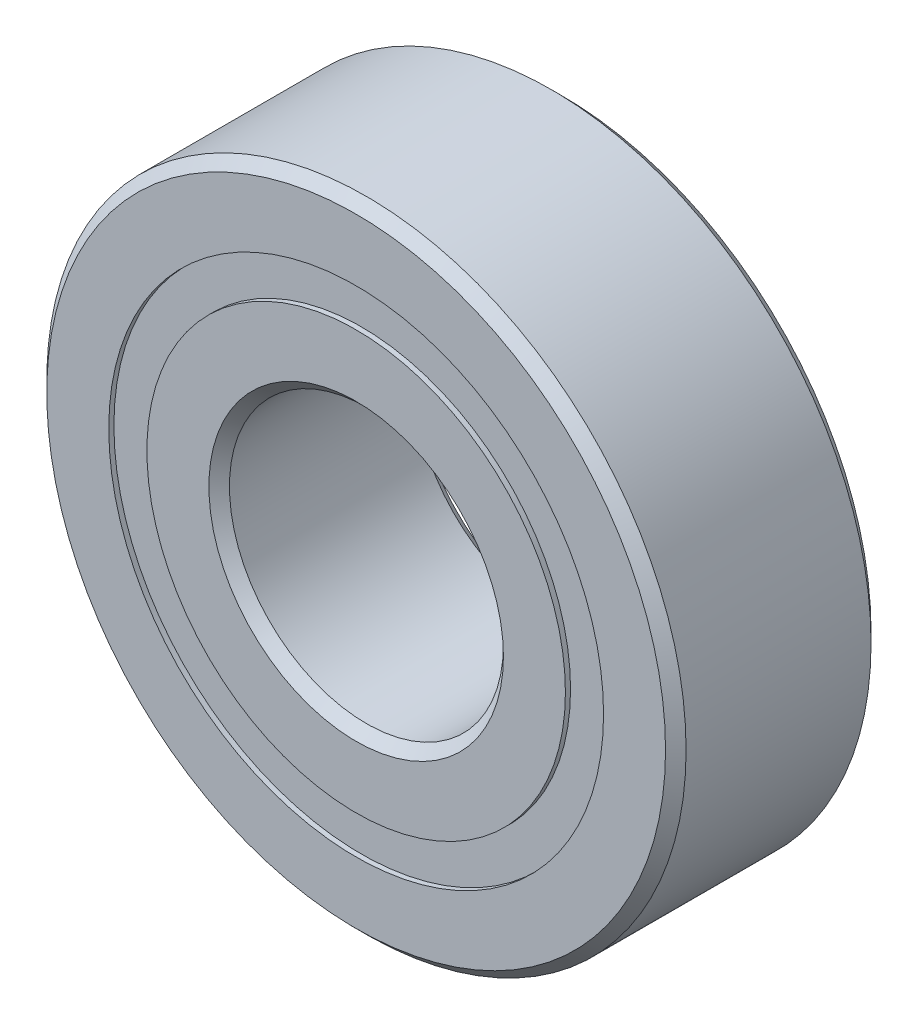
ISO-10303-21;
HEADER;
FILE_DESCRIPTION(('STEP AP214'),'2;1');
FILE_NAME('part.step','',(''),(''),'','','');
FILE_SCHEMA(('AUTOMOTIVE_DESIGN { 1 0 10303 214 1 1 1 1 }'));
ENDSEC;
DATA;
#1=APPLICATION_CONTEXT('core data for automotive mechanical design processes');
#2=APPLICATION_PROTOCOL_DEFINITION('international standard','automotive_design',2000,#1);
#3=PRODUCT_CONTEXT('',#1,'mechanical');
#4=PRODUCT('Part','Part','',(#3));
#5=PRODUCT_RELATED_PRODUCT_CATEGORY('part','',(#4));
#6=PRODUCT_DEFINITION_FORMATION('','',#4);
#7=PRODUCT_DEFINITION_CONTEXT('part definition',#1,'design');
#8=PRODUCT_DEFINITION('design','',#6,#7);
#9=PRODUCT_DEFINITION_SHAPE('','',#8);
#10=(LENGTH_UNIT() NAMED_UNIT(*) SI_UNIT(.MILLI.,.METRE.));
#11=(NAMED_UNIT(*) PLANE_ANGLE_UNIT() SI_UNIT($,.RADIAN.));
#12=(NAMED_UNIT(*) SI_UNIT($,.STERADIAN.) SOLID_ANGLE_UNIT());
#13=UNCERTAINTY_MEASURE_WITH_UNIT(LENGTH_MEASURE(1.E-05),#10,'distance_accuracy_value','');
#14=(GEOMETRIC_REPRESENTATION_CONTEXT(3) GLOBAL_UNCERTAINTY_ASSIGNED_CONTEXT((#13)) GLOBAL_UNIT_ASSIGNED_CONTEXT((#10,
#11,#12)) REPRESENTATION_CONTEXT('',''));
#15=CARTESIAN_POINT('',(0.,0.,0.));
#16=DIRECTION('',(0.,0.,1.));
#17=DIRECTION('',(1.,0.,0.));
#18=AXIS2_PLACEMENT_3D('',#15,#16,#17);
#19=CARTESIAN_POINT('',(0.,8.60041208791209,-3.39328125));
#20=DIRECTION('',(0.,0.,1.));
#21=DIRECTION('',(1.,0.,0.));
#22=AXIS2_PLACEMENT_3D('',#19,#20,#21);
#23=PLANE('',#22);
#24=CARTESIAN_POINT('',(0.,0.,-3.39328125));
#25=DIRECTION('',(0.,0.,1.));
#26=DIRECTION('',(1.,0.,0.));
#27=AXIS2_PLACEMENT_3D('',#24,#25,#26);
#28=CIRCLE('',#27,8.60041208791209);
#29=CARTESIAN_POINT('',(8.60041208791209,0.,-3.39328125));
#30=VERTEX_POINT('',#29);
#31=EDGE_CURVE('E58',#30,#30,#28,.T.);
#32=ORIENTED_EDGE('',*,*,#31,.F.);
#33=EDGE_LOOP('',(#32));
#34=FACE_BOUND('',#33,.T.);
#35=CARTESIAN_POINT('',(0.,0.,-3.39328125));
#36=DIRECTION('',(0.,0.,1.));
#37=DIRECTION('',(1.,0.,0.));
#38=AXIS2_PLACEMENT_3D('',#35,#36,#37);
#39=CIRCLE('',#38,7.27458791208791);
#40=CARTESIAN_POINT('',(7.27458791208791,0.,-3.39328125));
#41=VERTEX_POINT('',#40);
#42=EDGE_CURVE('E11',#41,#41,#39,.T.);
#43=ORIENTED_EDGE('',*,*,#42,.T.);
#44=EDGE_LOOP('',(#43));
#45=FACE_BOUND('',#44,.T.);
#46=ADVANCED_FACE('F44',(#34,#45),#23,.F.);
#47=CARTESIAN_POINT('',(0.,0.,3.571875));
#48=DIRECTION('',(0.,0.,1.));
#49=DIRECTION('',(1.,0.,0.));
#50=AXIS2_PLACEMENT_3D('',#47,#48,#49);
#51=CYLINDRICAL_SURFACE('',#50,7.27458791208791);
#52=ORIENTED_EDGE('',*,*,#42,.F.);
#53=EDGE_LOOP('',(#52));
#54=FACE_BOUND('',#53,.T.);
#55=CARTESIAN_POINT('',(0.,0.,-1.72035132641561));
#56=DIRECTION('',(0.,0.,1.));
#57=DIRECTION('',(1.,0.,0.));
#58=AXIS2_PLACEMENT_3D('',#55,#56,#57);
#59=CIRCLE('',#58,7.27458791208791);
#60=CARTESIAN_POINT('',(7.27458791208791,0.,-1.72035132641561));
#61=VERTEX_POINT('',#60);
#62=EDGE_CURVE('E50',#61,#61,#59,.T.);
#63=ORIENTED_EDGE('',*,*,#62,.T.);
#64=EDGE_LOOP('',(#63));
#65=FACE_BOUND('',#64,.T.);
#66=ADVANCED_FACE('F67',(#54,#65),#51,.F.);
#67=CARTESIAN_POINT('',(0.,8.60041208791209,-1.72035132641561));
#68=DIRECTION('',(0.,0.,-1.));
#69=DIRECTION('',(-1.,0.,0.));
#70=AXIS2_PLACEMENT_3D('',#67,#68,#69);
#71=PLANE('',#70);
#72=ORIENTED_EDGE('',*,*,#62,.F.);
#73=EDGE_LOOP('',(#72));
#74=FACE_BOUND('',#73,.T.);
#75=CARTESIAN_POINT('',(0.,0.,-1.72035132641561));
#76=DIRECTION('',(0.,0.,1.));
#77=DIRECTION('',(1.,0.,0.));
#78=AXIS2_PLACEMENT_3D('',#75,#76,#77);
#79=CIRCLE('',#78,8.60041208791209);
#80=CARTESIAN_POINT('',(8.60041208791209,0.,-1.72035132641561));
#81=VERTEX_POINT('',#80);
#82=EDGE_CURVE('E54',#81,#81,#79,.T.);
#83=ORIENTED_EDGE('',*,*,#82,.T.);
#84=EDGE_LOOP('',(#83));
#85=FACE_BOUND('',#84,.T.);
#86=ADVANCED_FACE('F71',(#74,#85),#71,.F.);
#87=CARTESIAN_POINT('',(0.,0.,3.571875));
#88=DIRECTION('',(0.,0.,1.));
#89=DIRECTION('',(1.,0.,0.));
#90=AXIS2_PLACEMENT_3D('',#87,#88,#89);
#91=CYLINDRICAL_SURFACE('',#90,8.60041208791209);
#92=ORIENTED_EDGE('',*,*,#82,.F.);
#93=EDGE_LOOP('',(#92));
#94=FACE_BOUND('',#93,.T.);
#95=ORIENTED_EDGE('',*,*,#31,.T.);
#96=EDGE_LOOP('',(#95));
#97=FACE_BOUND('',#96,.T.);
#98=ADVANCED_FACE('F64',(#94,#97),#91,.T.);
#99=CLOSED_SHELL('',(#46,#66,#86,#98));
#100=MANIFOLD_SOLID_BREP('B2',#99);
#101=CARTESIAN_POINT('',(0.,8.60041208791209,3.39328125));
#102=DIRECTION('',(0.,0.,-1.));
#103=DIRECTION('',(-1.,0.,0.));
#104=AXIS2_PLACEMENT_3D('',#101,#102,#103);
#105=PLANE('',#104);
#106=CARTESIAN_POINT('',(0.,0.,3.39328125));
#107=DIRECTION('',(0.,0.,1.));
#108=DIRECTION('',(1.,0.,0.));
#109=AXIS2_PLACEMENT_3D('',#106,#107,#108);
#110=CIRCLE('',#109,7.27458791208791);
#111=CARTESIAN_POINT('',(7.27458791208791,0.,3.39328125));
#112=VERTEX_POINT('',#111);
#113=EDGE_CURVE('E43',#112,#112,#110,.T.);
#114=ORIENTED_EDGE('',*,*,#113,.F.);
#115=EDGE_LOOP('',(#114));
#116=FACE_BOUND('',#115,.T.);
#117=CARTESIAN_POINT('',(0.,0.,3.39328125));
#118=DIRECTION('',(0.,0.,1.));
#119=DIRECTION('',(1.,0.,0.));
#120=AXIS2_PLACEMENT_3D('',#117,#118,#119);
#121=CIRCLE('',#120,8.60041208791209);
#122=CARTESIAN_POINT('',(8.60041208791209,0.,3.39328125));
#123=VERTEX_POINT('',#122);
#124=EDGE_CURVE('E126',#123,#123,#121,.T.);
#125=ORIENTED_EDGE('',*,*,#124,.T.);
#126=EDGE_LOOP('',(#125));
#127=FACE_BOUND('',#126,.T.);
#128=ADVANCED_FACE('F112',(#116,#127),#105,.F.);
#129=CARTESIAN_POINT('',(0.,0.,3.571875));
#130=DIRECTION('',(0.,0.,1.));
#131=DIRECTION('',(1.,0.,0.));
#132=AXIS2_PLACEMENT_3D('',#129,#130,#131);
#133=CYLINDRICAL_SURFACE('',#132,7.27458791208791);
#134=CARTESIAN_POINT('',(0.,0.,1.72035132641561));
#135=DIRECTION('',(0.,0.,1.));
#136=DIRECTION('',(1.,0.,0.));
#137=AXIS2_PLACEMENT_3D('',#134,#135,#136);
#138=CIRCLE('',#137,7.27458791208791);
#139=CARTESIAN_POINT('',(7.27458791208791,0.,1.72035132641561));
#140=VERTEX_POINT('',#139);
#141=EDGE_CURVE('E118',#140,#140,#138,.T.);
#142=ORIENTED_EDGE('',*,*,#141,.F.);
#143=EDGE_LOOP('',(#142));
#144=FACE_BOUND('',#143,.T.);
#145=ORIENTED_EDGE('',*,*,#113,.T.);
#146=EDGE_LOOP('',(#145));
#147=FACE_BOUND('',#146,.T.);
#148=ADVANCED_FACE('F141',(#144,#147),#133,.F.);
#149=CARTESIAN_POINT('',(0.,8.60041208791209,1.72035132641561));
#150=DIRECTION('',(0.,0.,1.));
#151=DIRECTION('',(1.,0.,0.));
#152=AXIS2_PLACEMENT_3D('',#149,#150,#151);
#153=PLANE('',#152);
#154=CARTESIAN_POINT('',(0.,0.,1.72035132641561));
#155=DIRECTION('',(0.,0.,1.));
#156=DIRECTION('',(1.,0.,0.));
#157=AXIS2_PLACEMENT_3D('',#154,#155,#156);
#158=CIRCLE('',#157,8.60041208791209);
#159=CARTESIAN_POINT('',(8.60041208791209,0.,1.72035132641561));
#160=VERTEX_POINT('',#159);
#161=EDGE_CURVE('E122',#160,#160,#158,.T.);
#162=ORIENTED_EDGE('',*,*,#161,.F.);
#163=EDGE_LOOP('',(#162));
#164=FACE_BOUND('',#163,.T.);
#165=ORIENTED_EDGE('',*,*,#141,.T.);
#166=EDGE_LOOP('',(#165));
#167=FACE_BOUND('',#166,.T.);
#168=ADVANCED_FACE('F136',(#164,#167),#153,.F.);
#169=CARTESIAN_POINT('',(0.,0.,3.571875));
#170=DIRECTION('',(0.,0.,1.));
#171=DIRECTION('',(1.,0.,0.));
#172=AXIS2_PLACEMENT_3D('',#169,#170,#171);
#173=CYLINDRICAL_SURFACE('',#172,8.60041208791209);
#174=ORIENTED_EDGE('',*,*,#124,.F.);
#175=EDGE_LOOP('',(#174));
#176=FACE_BOUND('',#175,.T.);
#177=ORIENTED_EDGE('',*,*,#161,.T.);
#178=EDGE_LOOP('',(#177));
#179=FACE_BOUND('',#178,.T.);
#180=ADVANCED_FACE('F133',(#176,#179),#173,.T.);
#181=CLOSED_SHELL('',(#128,#148,#168,#180));
#182=MANIFOLD_SOLID_BREP('B6',#181);
#183=CARTESIAN_POINT('',(-4.66554544007142,6.42157239285121,0.));
#184=DIRECTION('',(0.,0.,1.));
#185=DIRECTION('',(-0.587785252292462,0.809016994374955,0.));
#186=AXIS2_PLACEMENT_3D('',#183,#184,#185);
#187=SPHERICAL_SURFACE('',#186,1.72035132641561);
#188=CARTESIAN_POINT('',(-4.66554544007142,6.42157239285121,1.72035132641561));
#189=VERTEX_POINT('',#188);
#190=VERTEX_LOOP('',#189);
#191=FACE_BOUND('',#190,.T.);
#192=ADVANCED_FACE('F179',(#191),#187,.T.);
#193=CLOSED_SHELL('',(#192));
#194=MANIFOLD_SOLID_BREP('B38',#193);
#195=CARTESIAN_POINT('',(-7.54901109809275,2.45282239285123,0.));
#196=DIRECTION('',(0.,0.,1.));
#197=DIRECTION('',(-0.95105651629515,0.309016994374958,0.));
#198=AXIS2_PLACEMENT_3D('',#195,#196,#197);
#199=SPHERICAL_SURFACE('',#198,1.72035132641561);
#200=CARTESIAN_POINT('',(-7.54901109809275,2.45282239285123,1.72035132641561));
#201=VERTEX_POINT('',#200);
#202=VERTEX_LOOP('',#201);
#203=FACE_BOUND('',#202,.T.);
#204=ADVANCED_FACE('F199',(#203),#199,.T.);
#205=CLOSED_SHELL('',(#204));
#206=MANIFOLD_SOLID_BREP('B108',#205);
#207=CARTESIAN_POINT('',(-7.54901109809281,-2.45282239285107,0.));
#208=DIRECTION('',(0.,0.,1.));
#209=DIRECTION('',(-0.951056516295157,-0.309016994374938,0.));
#210=AXIS2_PLACEMENT_3D('',#207,#208,#209);
#211=SPHERICAL_SURFACE('',#210,1.72035132641561);
#212=CARTESIAN_POINT('',(-7.54901109809281,-2.45282239285107,1.72035132641561));
#213=VERTEX_POINT('',#212);
#214=VERTEX_LOOP('',#213);
#215=FACE_BOUND('',#214,.T.);
#216=ADVANCED_FACE('F219',(#215),#211,.T.);
#217=CLOSED_SHELL('',(#216));
#218=MANIFOLD_SOLID_BREP('B175',#217);
#219=CARTESIAN_POINT('',(-4.66554544007156,-6.42157239285111,0.));
#220=DIRECTION('',(0.,0.,1.));
#221=DIRECTION('',(-0.58778525229248,-0.809016994374942,0.));
#222=AXIS2_PLACEMENT_3D('',#219,#220,#221);
#223=SPHERICAL_SURFACE('',#222,1.72035132641561);
#224=CARTESIAN_POINT('',(-4.66554544007156,-6.42157239285111,1.72035132641561));
#225=VERTEX_POINT('',#224);
#226=VERTEX_LOOP('',#225);
#227=FACE_BOUND('',#226,.T.);
#228=ADVANCED_FACE('F239',(#227),#223,.T.);
#229=CLOSED_SHELL('',(#228));
#230=MANIFOLD_SOLID_BREP('B195',#229);
#231=CARTESIAN_POINT('',(0.,-7.9375,0.));
#232=DIRECTION('',(0.,0.,1.));
#233=DIRECTION('',(0.,-1.,0.));
#234=AXIS2_PLACEMENT_3D('',#231,#232,#233);
#235=SPHERICAL_SURFACE('',#234,1.72035132641561);
#236=CARTESIAN_POINT('',(0.,-7.9375,1.72035132641561));
#237=VERTEX_POINT('',#236);
#238=VERTEX_LOOP('',#237);
#239=FACE_BOUND('',#238,.T.);
#240=ADVANCED_FACE('F259',(#239),#235,.T.);
#241=CLOSED_SHELL('',(#240));
#242=MANIFOLD_SOLID_BREP('B215',#241);
#243=CARTESIAN_POINT('',(4.66554544007147,-6.42157239285117,0.));
#244=DIRECTION('',(0.,0.,1.));
#245=DIRECTION('',(0.587785252292469,-0.809016994374951,0.));
#246=AXIS2_PLACEMENT_3D('',#243,#244,#245);
#247=SPHERICAL_SURFACE('',#246,1.72035132641561);
#248=CARTESIAN_POINT('',(4.66554544007147,-6.42157239285117,1.72035132641561));
#249=VERTEX_POINT('',#248);
#250=VERTEX_LOOP('',#249);
#251=FACE_BOUND('',#250,.T.);
#252=ADVANCED_FACE('F279',(#251),#247,.T.);
#253=CLOSED_SHELL('',(#252));
#254=MANIFOLD_SOLID_BREP('B235',#253);
#255=CARTESIAN_POINT('',(7.54901109809277,-2.45282239285118,0.));
#256=DIRECTION('',(0.,0.,1.));
#257=DIRECTION('',(0.951056516295152,-0.309016994374952,0.));
#258=AXIS2_PLACEMENT_3D('',#255,#256,#257);
#259=SPHERICAL_SURFACE('',#258,1.72035132641561);
#260=CARTESIAN_POINT('',(7.54901109809277,-2.45282239285118,1.72035132641561));
#261=VERTEX_POINT('',#260);
#262=VERTEX_LOOP('',#261);
#263=FACE_BOUND('',#262,.T.);
#264=ADVANCED_FACE('F299',(#263),#259,.T.);
#265=CLOSED_SHELL('',(#264));
#266=MANIFOLD_SOLID_BREP('B255',#265);
#267=CARTESIAN_POINT('',(7.54901109809279,2.45282239285112,0.));
#268=DIRECTION('',(0.,0.,1.));
#269=DIRECTION('',(0.951056516295155,0.309016994374945,0.));
#270=AXIS2_PLACEMENT_3D('',#267,#268,#269);
#271=SPHERICAL_SURFACE('',#270,1.72035132641561);
#272=CARTESIAN_POINT('',(7.54901109809279,2.45282239285112,1.72035132641561));
#273=VERTEX_POINT('',#272);
#274=VERTEX_LOOP('',#273);
#275=FACE_BOUND('',#274,.T.);
#276=ADVANCED_FACE('F319',(#275),#271,.T.);
#277=CLOSED_SHELL('',(#276));
#278=MANIFOLD_SOLID_BREP('B275',#277);
#279=CARTESIAN_POINT('',(4.66554544007152,6.42157239285114,0.));
#280=DIRECTION('',(0.,0.,1.));
#281=DIRECTION('',(0.587785252292474,0.809016994374947,0.));
#282=AXIS2_PLACEMENT_3D('',#279,#280,#281);
#283=SPHERICAL_SURFACE('',#282,1.72035132641561);
#284=CARTESIAN_POINT('',(4.66554544007152,6.42157239285114,1.72035132641561));
#285=VERTEX_POINT('',#284);
#286=VERTEX_LOOP('',#285);
#287=FACE_BOUND('',#286,.T.);
#288=ADVANCED_FACE('F339',(#287),#283,.T.);
#289=CLOSED_SHELL('',(#288));
#290=MANIFOLD_SOLID_BREP('B295',#289);
#291=CARTESIAN_POINT('',(0.,7.9375,0.));
#292=DIRECTION('',(0.,0.,1.));
#293=DIRECTION('',(0.,1.,0.));
#294=AXIS2_PLACEMENT_3D('',#291,#292,#293);
#295=SPHERICAL_SURFACE('',#294,1.72035132641561);
#296=CARTESIAN_POINT('',(0.,7.9375,1.72035132641561));
#297=VERTEX_POINT('',#296);
#298=VERTEX_LOOP('',#297);
#299=FACE_BOUND('',#298,.T.);
#300=ADVANCED_FACE('F362',(#299),#295,.T.);
#301=CLOSED_SHELL('',(#300));
#302=MANIFOLD_SOLID_BREP('B315',#301);
#303=CARTESIAN_POINT('',(0.,7.27458791208791,3.571875));
#304=DIRECTION('',(0.,0.,-1.));
#305=DIRECTION('',(-1.,0.,0.));
#306=AXIS2_PLACEMENT_3D('',#303,#304,#305);
#307=PLANE('',#306);
#308=CARTESIAN_POINT('',(0.,0.,3.571875));
#309=DIRECTION('',(0.,0.,1.));
#310=DIRECTION('',(1.,0.,0.));
#311=AXIS2_PLACEMENT_3D('',#308,#309,#310);
#312=CIRCLE('',#311,5.1196875);
#313=CARTESIAN_POINT('',(5.1196875,0.,3.571875));
#314=VERTEX_POINT('',#313);
#315=EDGE_CURVE('E410',#314,#314,#312,.T.);
#316=ORIENTED_EDGE('',*,*,#315,.F.);
#317=EDGE_LOOP('',(#316));
#318=FACE_BOUND('',#317,.T.);
#319=CARTESIAN_POINT('',(0.,0.,3.571875));
#320=DIRECTION('',(0.,0.,1.));
#321=DIRECTION('',(1.,0.,0.));
#322=AXIS2_PLACEMENT_3D('',#319,#320,#321);
#323=CIRCLE('',#322,7.27458791208791);
#324=CARTESIAN_POINT('',(7.27458791208791,0.,3.571875));
#325=VERTEX_POINT('',#324);
#326=EDGE_CURVE('E361',#325,#325,#323,.T.);
#327=ORIENTED_EDGE('',*,*,#326,.T.);
#328=EDGE_LOOP('',(#327));
#329=FACE_BOUND('',#328,.T.);
#330=ADVANCED_FACE('F382',(#318,#329),#307,.F.);
#331=CARTESIAN_POINT('',(0.,0.,3.571875));
#332=DIRECTION('',(0.,0.,1.));
#333=DIRECTION('',(1.,0.,0.));
#334=AXIS2_PLACEMENT_3D('',#331,#332,#333);
#335=CYLINDRICAL_SURFACE('',#334,7.27458791208791);
#336=ORIENTED_EDGE('',*,*,#326,.F.);
#337=EDGE_LOOP('',(#336));
#338=FACE_BOUND('',#337,.T.);
#339=CARTESIAN_POINT('',(0.,0.,1.5875));
#340=DIRECTION('',(0.,0.,1.));
#341=DIRECTION('',(1.,0.,0.));
#342=AXIS2_PLACEMENT_3D('',#339,#340,#341);
#343=CIRCLE('',#342,7.27458791208791);
#344=CARTESIAN_POINT('',(7.27458791208791,0.,1.5875));
#345=VERTEX_POINT('',#344);
#346=EDGE_CURVE('E388',#345,#345,#343,.T.);
#347=ORIENTED_EDGE('',*,*,#346,.T.);
#348=EDGE_LOOP('',(#347));
#349=FACE_BOUND('',#348,.T.);
#350=ADVANCED_FACE('F417',(#338,#349),#335,.T.);
#351=CARTESIAN_POINT('',(0.,0.,0.));
#352=DIRECTION('',(0.,0.,1.));
#353=DIRECTION('',(1.,0.,0.));
#354=AXIS2_PLACEMENT_3D('',#351,#352,#353);
#355=TOROIDAL_SURFACE('',#354,7.93749999999999,1.72035132641561);
#356=ORIENTED_EDGE('',*,*,#346,.F.);
#357=EDGE_LOOP('',(#356));
#358=FACE_BOUND('',#357,.T.);
#359=CARTESIAN_POINT('',(0.,0.,-1.5875));
#360=DIRECTION('',(0.,0.,1.));
#361=DIRECTION('',(1.,0.,0.));
#362=AXIS2_PLACEMENT_3D('',#359,#360,#361);
#363=CIRCLE('',#362,7.27458791208791);
#364=CARTESIAN_POINT('',(7.27458791208791,0.,-1.5875));
#365=VERTEX_POINT('',#364);
#366=EDGE_CURVE('E392',#365,#365,#363,.T.);
#367=ORIENTED_EDGE('',*,*,#366,.T.);
#368=EDGE_LOOP('',(#367));
#369=FACE_BOUND('',#368,.T.);
#370=ADVANCED_FACE('F421',(#358,#369),#355,.F.);
#371=CARTESIAN_POINT('',(0.,0.,3.571875));
#372=DIRECTION('',(0.,0.,1.));
#373=DIRECTION('',(1.,0.,0.));
#374=AXIS2_PLACEMENT_3D('',#371,#372,#373);
#375=CYLINDRICAL_SURFACE('',#374,7.27458791208791);
#376=ORIENTED_EDGE('',*,*,#366,.F.);
#377=EDGE_LOOP('',(#376));
#378=FACE_BOUND('',#377,.T.);
#379=CARTESIAN_POINT('',(0.,0.,-3.571875));
#380=DIRECTION('',(0.,0.,1.));
#381=DIRECTION('',(1.,0.,0.));
#382=AXIS2_PLACEMENT_3D('',#379,#380,#381);
#383=CIRCLE('',#382,7.27458791208791);
#384=CARTESIAN_POINT('',(7.27458791208791,0.,-3.571875));
#385=VERTEX_POINT('',#384);
#386=EDGE_CURVE('E396',#385,#385,#383,.T.);
#387=ORIENTED_EDGE('',*,*,#386,.T.);
#388=EDGE_LOOP('',(#387));
#389=FACE_BOUND('',#388,.T.);
#390=ADVANCED_FACE('F426',(#378,#389),#375,.T.);
#391=CARTESIAN_POINT('',(0.,5.1196875,-3.571875));
#392=DIRECTION('',(0.,0.,1.));
#393=DIRECTION('',(1.,0.,0.));
#394=AXIS2_PLACEMENT_3D('',#391,#392,#393);
#395=PLANE('',#394);
#396=ORIENTED_EDGE('',*,*,#386,.F.);
#397=EDGE_LOOP('',(#396));
#398=FACE_BOUND('',#397,.T.);
#399=CARTESIAN_POINT('',(0.,0.,-3.571875));
#400=DIRECTION('',(0.,0.,1.));
#401=DIRECTION('',(1.,0.,0.));
#402=AXIS2_PLACEMENT_3D('',#399,#400,#401);
#403=CIRCLE('',#402,5.1196875);
#404=CARTESIAN_POINT('',(5.1196875,0.,-3.571875));
#405=VERTEX_POINT('',#404);
#406=EDGE_CURVE('E401',#405,#405,#403,.T.);
#407=ORIENTED_EDGE('',*,*,#406,.T.);
#408=EDGE_LOOP('',(#407));
#409=FACE_BOUND('',#408,.T.);
#410=ADVANCED_FACE('F432',(#398,#409),#395,.F.);
#411=CARTESIAN_POINT('',(0.,0.,-3.2146875));
#412=DIRECTION('',(0.,0.,-1.));
#413=DIRECTION('',(-1.,0.,0.));
#414=AXIS2_PLACEMENT_3D('',#411,#412,#413);
#415=CONICAL_SURFACE('',#414,4.7625,0.785398163397442);
#416=ORIENTED_EDGE('',*,*,#406,.F.);
#417=EDGE_LOOP('',(#416));
#418=FACE_BOUND('',#417,.T.);
#419=CARTESIAN_POINT('',(0.,0.,-3.2146875));
#420=DIRECTION('',(0.,0.,1.));
#421=DIRECTION('',(1.,0.,0.));
#422=AXIS2_PLACEMENT_3D('',#419,#420,#421);
#423=CIRCLE('',#422,4.7625);
#424=CARTESIAN_POINT('',(4.7625,0.,-3.2146875));
#425=VERTEX_POINT('',#424);
#426=EDGE_CURVE('E404',#425,#425,#423,.T.);
#427=ORIENTED_EDGE('',*,*,#426,.T.);
#428=EDGE_LOOP('',(#427));
#429=FACE_BOUND('',#428,.T.);
#430=ADVANCED_FACE('F436',(#418,#429),#415,.F.);
#431=CARTESIAN_POINT('',(0.,0.,3.571875));
#432=DIRECTION('',(0.,0.,1.));
#433=DIRECTION('',(1.,0.,0.));
#434=AXIS2_PLACEMENT_3D('',#431,#432,#433);
#435=CYLINDRICAL_SURFACE('',#434,4.7625);
#436=ORIENTED_EDGE('',*,*,#426,.F.);
#437=EDGE_LOOP('',(#436));
#438=FACE_BOUND('',#437,.T.);
#439=CARTESIAN_POINT('',(0.,0.,3.2146875));
#440=DIRECTION('',(0.,0.,1.));
#441=DIRECTION('',(1.,0.,0.));
#442=AXIS2_PLACEMENT_3D('',#439,#440,#441);
#443=CIRCLE('',#442,4.7625);
#444=CARTESIAN_POINT('',(4.7625,0.,3.2146875));
#445=VERTEX_POINT('',#444);
#446=EDGE_CURVE('E407',#445,#445,#443,.T.);
#447=ORIENTED_EDGE('',*,*,#446,.T.);
#448=EDGE_LOOP('',(#447));
#449=FACE_BOUND('',#448,.T.);
#450=ADVANCED_FACE('F440',(#438,#449),#435,.F.);
#451=CARTESIAN_POINT('',(0.,0.,3.571875));
#452=DIRECTION('',(0.,0.,1.));
#453=DIRECTION('',(1.,0.,0.));
#454=AXIS2_PLACEMENT_3D('',#451,#452,#453);
#455=CONICAL_SURFACE('',#454,5.1196875,0.785398163397453);
#456=ORIENTED_EDGE('',*,*,#446,.F.);
#457=EDGE_LOOP('',(#456));
#458=FACE_BOUND('',#457,.T.);
#459=ORIENTED_EDGE('',*,*,#315,.T.);
#460=EDGE_LOOP('',(#459));
#461=FACE_BOUND('',#460,.T.);
#462=ADVANCED_FACE('F414',(#458,#461),#455,.F.);
#463=CLOSED_SHELL('',(#330,#350,#370,#390,#410,#430,#450,#462));
#464=MANIFOLD_SOLID_BREP('B335',#463);
#465=CARTESIAN_POINT('',(0.,0.,3.2146875));
#466=DIRECTION('',(0.,0.,-1.));
#467=DIRECTION('',(-1.,0.,0.));
#468=AXIS2_PLACEMENT_3D('',#465,#466,#467);
#469=CONICAL_SURFACE('',#468,11.1125,0.785398163397446);
#470=CARTESIAN_POINT('',(0.,0.,3.571875));
#471=DIRECTION('',(0.,0.,1.));
#472=DIRECTION('',(1.,0.,0.));
#473=AXIS2_PLACEMENT_3D('',#470,#471,#472);
#474=CIRCLE('',#473,10.7553125);
#475=CARTESIAN_POINT('',(10.7553125,0.,3.571875));
#476=VERTEX_POINT('',#475);
#477=EDGE_CURVE('E532',#476,#476,#474,.T.);
#478=ORIENTED_EDGE('',*,*,#477,.F.);
#479=EDGE_LOOP('',(#478));
#480=FACE_BOUND('',#479,.T.);
#481=CARTESIAN_POINT('',(0.,0.,3.2146875));
#482=DIRECTION('',(0.,0.,1.));
#483=DIRECTION('',(1.,0.,0.));
#484=AXIS2_PLACEMENT_3D('',#481,#482,#483);
#485=CIRCLE('',#484,11.1125);
#486=CARTESIAN_POINT('',(11.1125,0.,3.2146875));
#487=VERTEX_POINT('',#486);
#488=EDGE_CURVE('E381',#487,#487,#485,.T.);
#489=ORIENTED_EDGE('',*,*,#488,.T.);
#490=EDGE_LOOP('',(#489));
#491=FACE_BOUND('',#490,.T.);
#492=ADVANCED_FACE('F504',(#480,#491),#469,.T.);
#493=CARTESIAN_POINT('',(0.,0.,3.571875));
#494=DIRECTION('',(0.,0.,1.));
#495=DIRECTION('',(1.,0.,0.));
#496=AXIS2_PLACEMENT_3D('',#493,#494,#495);
#497=CYLINDRICAL_SURFACE('',#496,11.1125);
#498=ORIENTED_EDGE('',*,*,#488,.F.);
#499=EDGE_LOOP('',(#498));
#500=FACE_BOUND('',#499,.T.);
#501=CARTESIAN_POINT('',(0.,0.,-3.2146875));
#502=DIRECTION('',(0.,0.,1.));
#503=DIRECTION('',(1.,0.,0.));
#504=AXIS2_PLACEMENT_3D('',#501,#502,#503);
#505=CIRCLE('',#504,11.1125);
#506=CARTESIAN_POINT('',(11.1125,0.,-3.2146875));
#507=VERTEX_POINT('',#506);
#508=EDGE_CURVE('E510',#507,#507,#505,.T.);
#509=ORIENTED_EDGE('',*,*,#508,.T.);
#510=EDGE_LOOP('',(#509));
#511=FACE_BOUND('',#510,.T.);
#512=ADVANCED_FACE('F539',(#500,#511),#497,.T.);
#513=CARTESIAN_POINT('',(0.,0.,-3.571875));
#514=DIRECTION('',(0.,0.,1.));
#515=DIRECTION('',(1.,0.,0.));
#516=AXIS2_PLACEMENT_3D('',#513,#514,#515);
#517=CONICAL_SURFACE('',#516,10.7553125,0.785398163397444);
#518=ORIENTED_EDGE('',*,*,#508,.F.);
#519=EDGE_LOOP('',(#518));
#520=FACE_BOUND('',#519,.T.);
#521=CARTESIAN_POINT('',(0.,0.,-3.571875));
#522=DIRECTION('',(0.,0.,1.));
#523=DIRECTION('',(1.,0.,0.));
#524=AXIS2_PLACEMENT_3D('',#521,#522,#523);
#525=CIRCLE('',#524,10.7553125);
#526=CARTESIAN_POINT('',(10.7553125,0.,-3.571875));
#527=VERTEX_POINT('',#526);
#528=EDGE_CURVE('E514',#527,#527,#525,.T.);
#529=ORIENTED_EDGE('',*,*,#528,.T.);
#530=EDGE_LOOP('',(#529));
#531=FACE_BOUND('',#530,.T.);
#532=ADVANCED_FACE('F543',(#520,#531),#517,.T.);
#533=CARTESIAN_POINT('',(0.,10.7553125,-3.571875));
#534=DIRECTION('',(0.,0.,1.));
#535=DIRECTION('',(1.,0.,0.));
#536=AXIS2_PLACEMENT_3D('',#533,#534,#535);
#537=PLANE('',#536);
#538=ORIENTED_EDGE('',*,*,#528,.F.);
#539=EDGE_LOOP('',(#538));
#540=FACE_BOUND('',#539,.T.);
#541=CARTESIAN_POINT('',(0.,0.,-3.571875));
#542=DIRECTION('',(0.,0.,1.));
#543=DIRECTION('',(1.,0.,0.));
#544=AXIS2_PLACEMENT_3D('',#541,#542,#543);
#545=CIRCLE('',#544,8.60041208791209);
#546=CARTESIAN_POINT('',(8.60041208791209,0.,-3.571875));
#547=VERTEX_POINT('',#546);
#548=EDGE_CURVE('E518',#547,#547,#545,.T.);
#549=ORIENTED_EDGE('',*,*,#548,.T.);
#550=EDGE_LOOP('',(#549));
#551=FACE_BOUND('',#550,.T.);
#552=ADVANCED_FACE('F548',(#540,#551),#537,.F.);
#553=CARTESIAN_POINT('',(0.,0.,3.571875));
#554=DIRECTION('',(0.,0.,1.));
#555=DIRECTION('',(1.,0.,0.));
#556=AXIS2_PLACEMENT_3D('',#553,#554,#555);
#557=CYLINDRICAL_SURFACE('',#556,8.60041208791209);
#558=ORIENTED_EDGE('',*,*,#548,.F.);
#559=EDGE_LOOP('',(#558));
#560=FACE_BOUND('',#559,.T.);
#561=CARTESIAN_POINT('',(0.,0.,-1.5875));
#562=DIRECTION('',(0.,0.,1.));
#563=DIRECTION('',(1.,0.,0.));
#564=AXIS2_PLACEMENT_3D('',#561,#562,#563);
#565=CIRCLE('',#564,8.60041208791209);
#566=CARTESIAN_POINT('',(8.60041208791209,0.,-1.5875));
#567=VERTEX_POINT('',#566);
#568=EDGE_CURVE('E523',#567,#567,#565,.T.);
#569=ORIENTED_EDGE('',*,*,#568,.T.);
#570=EDGE_LOOP('',(#569));
#571=FACE_BOUND('',#570,.T.);
#572=ADVANCED_FACE('F554',(#560,#571),#557,.F.);
#573=CARTESIAN_POINT('',(0.,0.,0.));
#574=DIRECTION('',(0.,0.,1.));
#575=DIRECTION('',(1.,0.,0.));
#576=AXIS2_PLACEMENT_3D('',#573,#574,#575);
#577=TOROIDAL_SURFACE('',#576,7.9375,1.72035132641561);
#578=ORIENTED_EDGE('',*,*,#568,.F.);
#579=EDGE_LOOP('',(#578));
#580=FACE_BOUND('',#579,.T.);
#581=CARTESIAN_POINT('',(0.,0.,1.5875));
#582=DIRECTION('',(0.,0.,1.));
#583=DIRECTION('',(1.,0.,0.));
#584=AXIS2_PLACEMENT_3D('',#581,#582,#583);
#585=CIRCLE('',#584,8.60041208791209);
#586=CARTESIAN_POINT('',(8.60041208791209,0.,1.5875));
#587=VERTEX_POINT('',#586);
#588=EDGE_CURVE('E526',#587,#587,#585,.T.);
#589=ORIENTED_EDGE('',*,*,#588,.T.);
#590=EDGE_LOOP('',(#589));
#591=FACE_BOUND('',#590,.T.);
#592=ADVANCED_FACE('F558',(#580,#591),#577,.F.);
#593=CARTESIAN_POINT('',(0.,0.,3.571875));
#594=DIRECTION('',(0.,0.,1.));
#595=DIRECTION('',(1.,0.,0.));
#596=AXIS2_PLACEMENT_3D('',#593,#594,#595);
#597=CYLINDRICAL_SURFACE('',#596,8.60041208791209);
#598=ORIENTED_EDGE('',*,*,#588,.F.);
#599=EDGE_LOOP('',(#598));
#600=FACE_BOUND('',#599,.T.);
#601=CARTESIAN_POINT('',(0.,0.,3.571875));
#602=DIRECTION('',(0.,0.,1.));
#603=DIRECTION('',(1.,0.,0.));
#604=AXIS2_PLACEMENT_3D('',#601,#602,#603);
#605=CIRCLE('',#604,8.60041208791209);
#606=CARTESIAN_POINT('',(8.60041208791209,0.,3.571875));
#607=VERTEX_POINT('',#606);
#608=EDGE_CURVE('E529',#607,#607,#605,.T.);
#609=ORIENTED_EDGE('',*,*,#608,.T.);
#610=EDGE_LOOP('',(#609));
#611=FACE_BOUND('',#610,.T.);
#612=ADVANCED_FACE('F562',(#600,#611),#597,.F.);
#613=CARTESIAN_POINT('',(0.,10.7553125,3.571875));
#614=DIRECTION('',(0.,0.,-1.));
#615=DIRECTION('',(-1.,0.,0.));
#616=AXIS2_PLACEMENT_3D('',#613,#614,#615);
#617=PLANE('',#616);
#618=ORIENTED_EDGE('',*,*,#608,.F.);
#619=EDGE_LOOP('',(#618));
#620=FACE_BOUND('',#619,.T.);
#621=ORIENTED_EDGE('',*,*,#477,.T.);
#622=EDGE_LOOP('',(#621));
#623=FACE_BOUND('',#622,.T.);
#624=ADVANCED_FACE('F536',(#620,#623),#617,.F.);
#625=CLOSED_SHELL('',(#492,#512,#532,#552,#572,#592,#612,#624));
#626=MANIFOLD_SOLID_BREP('B356',#625);
#627=ADVANCED_BREP_SHAPE_REPRESENTATION('',(#18,#100,#182,#194,#206,#218,#230,#242,#254,#266,
#278,#290,#302,#464,#626),#14);
#628=SHAPE_DEFINITION_REPRESENTATION(#9,#627);
ENDSEC;
END-ISO-10303-21;
